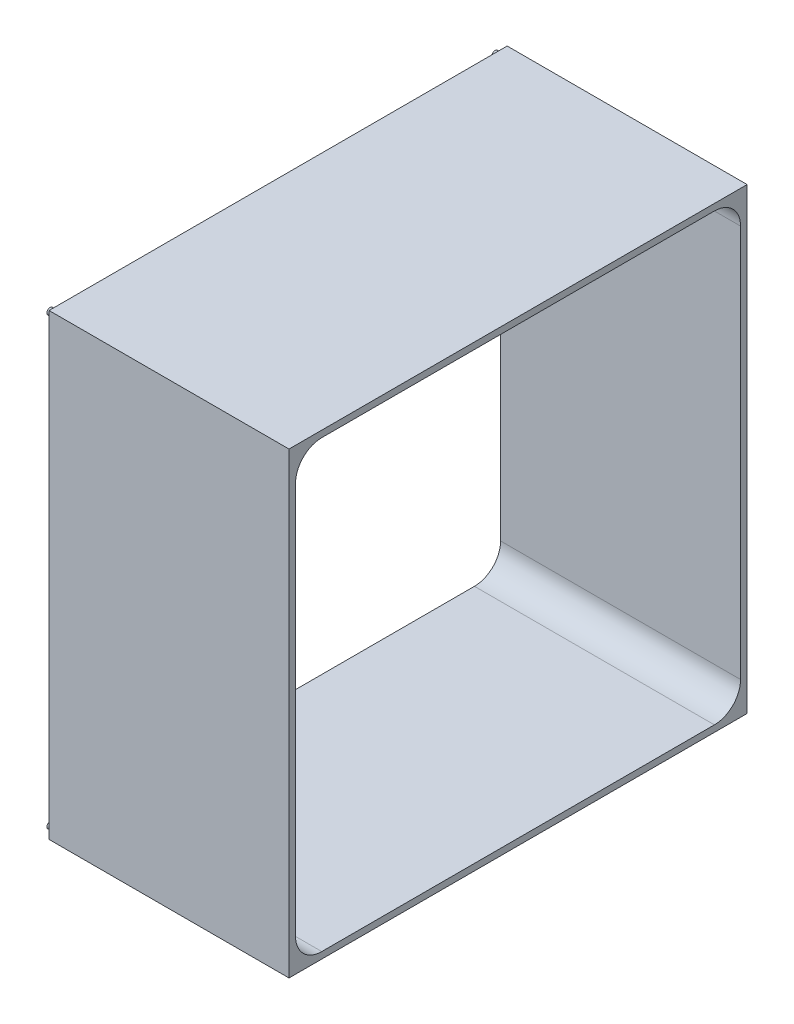
ISO-10303-21;
HEADER;
FILE_DESCRIPTION(('STEP AP214'),'2;1');
FILE_NAME('part.step','',(''),(''),'','','');
FILE_SCHEMA(('AUTOMOTIVE_DESIGN { 1 0 10303 214 1 1 1 1 }'));
ENDSEC;
DATA;
#1=APPLICATION_CONTEXT('core data for automotive mechanical design processes');
#2=APPLICATION_PROTOCOL_DEFINITION('international standard','automotive_design',2000,#1);
#3=PRODUCT_CONTEXT('',#1,'mechanical');
#4=PRODUCT('Part','Part','',(#3));
#5=PRODUCT_RELATED_PRODUCT_CATEGORY('part','',(#4));
#6=PRODUCT_DEFINITION_FORMATION('','',#4);
#7=PRODUCT_DEFINITION_CONTEXT('part definition',#1,'design');
#8=PRODUCT_DEFINITION('design','',#6,#7);
#9=PRODUCT_DEFINITION_SHAPE('','',#8);
#10=(LENGTH_UNIT() NAMED_UNIT(*) SI_UNIT(.MILLI.,.METRE.));
#11=(NAMED_UNIT(*) PLANE_ANGLE_UNIT() SI_UNIT($,.RADIAN.));
#12=(NAMED_UNIT(*) SI_UNIT($,.STERADIAN.) SOLID_ANGLE_UNIT());
#13=UNCERTAINTY_MEASURE_WITH_UNIT(LENGTH_MEASURE(1.E-05),#10,'distance_accuracy_value','');
#14=(GEOMETRIC_REPRESENTATION_CONTEXT(3) GLOBAL_UNCERTAINTY_ASSIGNED_CONTEXT((#13)) GLOBAL_UNIT_ASSIGNED_CONTEXT((#10,
#11,#12)) REPRESENTATION_CONTEXT('',''));
#15=CARTESIAN_POINT('',(0.,0.,0.));
#16=DIRECTION('',(0.,0.,1.));
#17=DIRECTION('',(1.,0.,0.));
#18=AXIS2_PLACEMENT_3D('',#15,#16,#17);
#19=CARTESIAN_POINT('',(110.,105.,-105.));
#20=DIRECTION('',(0.,0.,1.));
#21=DIRECTION('',(0.,-1.,0.));
#22=AXIS2_PLACEMENT_3D('',#19,#20,#21);
#23=PLANE('',#22);
#24=DIRECTION('',(0.,1.,0.));
#25=VECTOR('',#24,1.);
#26=CARTESIAN_POINT('',(0.,105.,-105.));
#27=LINE('',#26,#25);
#28=CARTESIAN_POINT('',(0.,-105.,-105.));
#29=VERTEX_POINT('',#28);
#30=CARTESIAN_POINT('',(0.,105.,-105.));
#31=VERTEX_POINT('',#30);
#32=EDGE_CURVE('E153',#29,#31,#27,.T.);
#33=ORIENTED_EDGE('',*,*,#32,.T.);
#34=DIRECTION('',(-1.,0.,0.));
#35=VECTOR('',#34,1.);
#36=CARTESIAN_POINT('',(110.,105.,-105.));
#37=LINE('',#36,#35);
#38=CARTESIAN_POINT('',(110.,105.,-105.));
#39=VERTEX_POINT('',#38);
#40=EDGE_CURVE('E133',#39,#31,#37,.T.);
#41=ORIENTED_EDGE('',*,*,#40,.F.);
#42=DIRECTION('',(0.,1.,0.));
#43=VECTOR('',#42,1.);
#44=CARTESIAN_POINT('',(110.,105.,-105.));
#45=LINE('',#44,#43);
#46=CARTESIAN_POINT('',(110.,-105.,-105.));
#47=VERTEX_POINT('',#46);
#48=EDGE_CURVE('E143',#47,#39,#45,.T.);
#49=ORIENTED_EDGE('',*,*,#48,.F.);
#50=DIRECTION('',(-1.,0.,0.));
#51=VECTOR('',#50,1.);
#52=CARTESIAN_POINT('',(110.,-105.,-105.));
#53=LINE('',#52,#51);
#54=EDGE_CURVE('E225',#47,#29,#53,.T.);
#55=ORIENTED_EDGE('',*,*,#54,.T.);
#56=EDGE_LOOP('',(#33,#41,#49,#55));
#57=FACE_BOUND('',#56,.T.);
#58=ADVANCED_FACE('F39',(#57),#23,.F.);
#59=CARTESIAN_POINT('',(110.,105.,105.));
#60=DIRECTION('',(0.,-1.,0.));
#61=DIRECTION('',(0.,0.,-1.));
#62=AXIS2_PLACEMENT_3D('',#59,#60,#61);
#63=PLANE('',#62);
#64=DIRECTION('',(0.,0.,1.));
#65=VECTOR('',#64,1.);
#66=CARTESIAN_POINT('',(0.,105.,105.));
#67=LINE('',#66,#65);
#68=CARTESIAN_POINT('',(0.,105.,105.));
#69=VERTEX_POINT('',#68);
#70=EDGE_CURVE('E221',#31,#69,#67,.T.);
#71=ORIENTED_EDGE('',*,*,#70,.T.);
#72=DIRECTION('',(-1.,0.,0.));
#73=VECTOR('',#72,1.);
#74=CARTESIAN_POINT('',(110.,105.,105.));
#75=LINE('',#74,#73);
#76=CARTESIAN_POINT('',(110.,105.,105.));
#77=VERTEX_POINT('',#76);
#78=EDGE_CURVE('E140',#77,#69,#75,.T.);
#79=ORIENTED_EDGE('',*,*,#78,.F.);
#80=DIRECTION('',(0.,0.,1.));
#81=VECTOR('',#80,1.);
#82=CARTESIAN_POINT('',(110.,105.,105.));
#83=LINE('',#82,#81);
#84=EDGE_CURVE('E128',#39,#77,#83,.T.);
#85=ORIENTED_EDGE('',*,*,#84,.F.);
#86=ORIENTED_EDGE('',*,*,#40,.T.);
#87=EDGE_LOOP('',(#71,#79,#85,#86));
#88=FACE_BOUND('',#87,.T.);
#89=ADVANCED_FACE('F135',(#88),#63,.F.);
#90=CARTESIAN_POINT('',(110.,105.,105.));
#91=DIRECTION('',(0.,0.,-1.));
#92=DIRECTION('',(0.,1.,0.));
#93=AXIS2_PLACEMENT_3D('',#90,#91,#92);
#94=PLANE('',#93);
#95=DIRECTION('',(0.,-1.,0.));
#96=VECTOR('',#95,1.);
#97=CARTESIAN_POINT('',(0.,105.,105.));
#98=LINE('',#97,#96);
#99=CARTESIAN_POINT('',(0.,-105.,105.));
#100=VERTEX_POINT('',#99);
#101=EDGE_CURVE('E226',#69,#100,#98,.T.);
#102=ORIENTED_EDGE('',*,*,#101,.T.);
#103=DIRECTION('',(-1.,0.,0.));
#104=VECTOR('',#103,1.);
#105=CARTESIAN_POINT('',(110.,-105.,105.));
#106=LINE('',#105,#104);
#107=CARTESIAN_POINT('',(110.,-105.,105.));
#108=VERTEX_POINT('',#107);
#109=EDGE_CURVE('E158',#108,#100,#106,.T.);
#110=ORIENTED_EDGE('',*,*,#109,.F.);
#111=DIRECTION('',(0.,-1.,0.));
#112=VECTOR('',#111,1.);
#113=CARTESIAN_POINT('',(110.,105.,105.));
#114=LINE('',#113,#112);
#115=EDGE_CURVE('E138',#77,#108,#114,.T.);
#116=ORIENTED_EDGE('',*,*,#115,.F.);
#117=ORIENTED_EDGE('',*,*,#78,.T.);
#118=EDGE_LOOP('',(#102,#110,#116,#117));
#119=FACE_BOUND('',#118,.T.);
#120=ADVANCED_FACE('F236',(#119),#94,.F.);
#121=CARTESIAN_POINT('',(110.,-105.,105.));
#122=DIRECTION('',(0.,1.,0.));
#123=DIRECTION('',(0.,0.,1.));
#124=AXIS2_PLACEMENT_3D('',#121,#122,#123);
#125=PLANE('',#124);
#126=DIRECTION('',(0.,0.,-1.));
#127=VECTOR('',#126,1.);
#128=CARTESIAN_POINT('',(0.,-105.,105.));
#129=LINE('',#128,#127);
#130=EDGE_CURVE('E147',#100,#29,#129,.T.);
#131=ORIENTED_EDGE('',*,*,#130,.T.);
#132=ORIENTED_EDGE('',*,*,#54,.F.);
#133=DIRECTION('',(0.,0.,-1.));
#134=VECTOR('',#133,1.);
#135=CARTESIAN_POINT('',(110.,-105.,105.));
#136=LINE('',#135,#134);
#137=EDGE_CURVE('E148',#108,#47,#136,.T.);
#138=ORIENTED_EDGE('',*,*,#137,.F.);
#139=ORIENTED_EDGE('',*,*,#109,.T.);
#140=EDGE_LOOP('',(#131,#132,#138,#139));
#141=FACE_BOUND('',#140,.T.);
#142=ADVANCED_FACE('F234',(#141),#125,.F.);
#143=CARTESIAN_POINT('',(110.,0.,0.));
#144=DIRECTION('',(1.,0.,0.));
#145=DIRECTION('',(0.,0.,-1.));
#146=AXIS2_PLACEMENT_3D('',#143,#144,#145);
#147=PLANE('',#146);
#148=DIRECTION('',(0.,0.,-1.));
#149=VECTOR('',#148,1.);
#150=CARTESIAN_POINT('',(110.,-102.,102.));
#151=LINE('',#150,#149);
#152=CARTESIAN_POINT('',(110.,-102.,90.));
#153=VERTEX_POINT('',#152);
#154=CARTESIAN_POINT('',(110.,-102.,-90.));
#155=VERTEX_POINT('',#154);
#156=EDGE_CURVE('E209',#153,#155,#151,.T.);
#157=ORIENTED_EDGE('',*,*,#156,.F.);
#158=CARTESIAN_POINT('',(110.,-90.,90.));
#159=DIRECTION('',(1.,0.,0.));
#160=DIRECTION('',(0.,0.,-1.));
#161=AXIS2_PLACEMENT_3D('',#158,#159,#160);
#162=CIRCLE('',#161,12.);
#163=CARTESIAN_POINT('',(110.,-90.,102.));
#164=VERTEX_POINT('',#163);
#165=EDGE_CURVE('E186',#153,#164,#162,.F.);
#166=ORIENTED_EDGE('',*,*,#165,.T.);
#167=DIRECTION('',(0.,-1.,0.));
#168=VECTOR('',#167,1.);
#169=CARTESIAN_POINT('',(110.,102.,102.));
#170=LINE('',#169,#168);
#171=CARTESIAN_POINT('',(110.,90.,102.));
#172=VERTEX_POINT('',#171);
#173=EDGE_CURVE('E201',#172,#164,#170,.T.);
#174=ORIENTED_EDGE('',*,*,#173,.F.);
#175=CARTESIAN_POINT('',(110.,90.,90.0000000000001));
#176=DIRECTION('',(1.,0.,0.));
#177=DIRECTION('',(0.,0.,-1.));
#178=AXIS2_PLACEMENT_3D('',#175,#176,#177);
#179=CIRCLE('',#178,12.);
#180=CARTESIAN_POINT('',(110.,102.,90.0000000000001));
#181=VERTEX_POINT('',#180);
#182=EDGE_CURVE('E189',#172,#181,#179,.F.);
#183=ORIENTED_EDGE('',*,*,#182,.T.);
#184=DIRECTION('',(0.,0.,1.));
#185=VECTOR('',#184,1.);
#186=CARTESIAN_POINT('',(110.,102.,-102.));
#187=LINE('',#186,#185);
#188=CARTESIAN_POINT('',(110.,102.,-89.9999999999999));
#189=VERTEX_POINT('',#188);
#190=EDGE_CURVE('E216',#189,#181,#187,.T.);
#191=ORIENTED_EDGE('',*,*,#190,.F.);
#192=CARTESIAN_POINT('',(110.,90.,-89.9999999999999));
#193=DIRECTION('',(1.,0.,0.));
#194=DIRECTION('',(0.,0.,-1.));
#195=AXIS2_PLACEMENT_3D('',#192,#193,#194);
#196=CIRCLE('',#195,12.);
#197=CARTESIAN_POINT('',(110.,90.,-102.));
#198=VERTEX_POINT('',#197);
#199=EDGE_CURVE('E185',#189,#198,#196,.F.);
#200=ORIENTED_EDGE('',*,*,#199,.T.);
#201=DIRECTION('',(0.,1.,0.));
#202=VECTOR('',#201,1.);
#203=CARTESIAN_POINT('',(110.,-102.,-102.));
#204=LINE('',#203,#202);
#205=CARTESIAN_POINT('',(110.,-90.,-102.));
#206=VERTEX_POINT('',#205);
#207=EDGE_CURVE('E213',#206,#198,#204,.T.);
#208=ORIENTED_EDGE('',*,*,#207,.F.);
#209=CARTESIAN_POINT('',(110.,-90.,-90.));
#210=DIRECTION('',(1.,0.,0.));
#211=DIRECTION('',(0.,0.,-1.));
#212=AXIS2_PLACEMENT_3D('',#209,#210,#211);
#213=CIRCLE('',#212,12.);
#214=EDGE_CURVE('E179',#206,#155,#213,.F.);
#215=ORIENTED_EDGE('',*,*,#214,.T.);
#216=EDGE_LOOP('',(#157,#166,#174,#183,#191,#200,#208,#215));
#217=FACE_BOUND('',#216,.T.);
#218=ORIENTED_EDGE('',*,*,#48,.T.);
#219=ORIENTED_EDGE('',*,*,#84,.T.);
#220=ORIENTED_EDGE('',*,*,#115,.T.);
#221=ORIENTED_EDGE('',*,*,#137,.T.);
#222=EDGE_LOOP('',(#218,#219,#220,#221));
#223=FACE_BOUND('',#222,.T.);
#224=ADVANCED_FACE('F145',(#217,#223),#147,.T.);
#225=CARTESIAN_POINT('',(0.,0.,0.));
#226=DIRECTION('',(1.,0.,0.));
#227=DIRECTION('',(0.,0.,-1.));
#228=AXIS2_PLACEMENT_3D('',#225,#226,#227);
#229=PLANE('',#228);
#230=CARTESIAN_POINT('',(0.,-102.,102.));
#231=DIRECTION('',(1.,0.,0.));
#232=DIRECTION('',(0.,0.,-1.));
#233=AXIS2_PLACEMENT_3D('',#230,#231,#232);
#234=CIRCLE('',#233,1.5);
#235=CARTESIAN_POINT('',(0.,-102.,100.5));
#236=VERTEX_POINT('',#235);
#237=EDGE_CURVE('E11',#236,#236,#234,.F.);
#238=ORIENTED_EDGE('',*,*,#237,.F.);
#239=EDGE_LOOP('',(#238));
#240=FACE_BOUND('',#239,.T.);
#241=CARTESIAN_POINT('',(0.,-102.,-102.));
#242=DIRECTION('',(1.,0.,0.));
#243=DIRECTION('',(0.,0.,1.));
#244=AXIS2_PLACEMENT_3D('',#241,#242,#243);
#245=CIRCLE('',#244,1.5);
#246=CARTESIAN_POINT('',(0.,-102.,-100.5));
#247=VERTEX_POINT('',#246);
#248=EDGE_CURVE('E344',#247,#247,#245,.T.);
#249=ORIENTED_EDGE('',*,*,#248,.T.);
#250=EDGE_LOOP('',(#249));
#251=FACE_BOUND('',#250,.T.);
#252=CARTESIAN_POINT('',(0.,102.,102.));
#253=DIRECTION('',(1.,0.,0.));
#254=DIRECTION('',(0.,0.,-1.));
#255=AXIS2_PLACEMENT_3D('',#252,#253,#254);
#256=CIRCLE('',#255,1.5);
#257=CARTESIAN_POINT('',(0.,102.,100.5));
#258=VERTEX_POINT('',#257);
#259=EDGE_CURVE('E348',#258,#258,#256,.T.);
#260=ORIENTED_EDGE('',*,*,#259,.T.);
#261=EDGE_LOOP('',(#260));
#262=FACE_BOUND('',#261,.T.);
#263=CARTESIAN_POINT('',(0.,102.,-102.));
#264=DIRECTION('',(-1.,0.,0.));
#265=DIRECTION('',(0.,0.,1.));
#266=AXIS2_PLACEMENT_3D('',#263,#264,#265);
#267=CIRCLE('',#266,1.5);
#268=CARTESIAN_POINT('',(0.,102.,-100.5));
#269=VERTEX_POINT('',#268);
#270=EDGE_CURVE('E50',#269,#269,#267,.T.);
#271=ORIENTED_EDGE('',*,*,#270,.F.);
#272=EDGE_LOOP('',(#271));
#273=FACE_BOUND('',#272,.T.);
#274=DIRECTION('',(0.,0.,1.));
#275=VECTOR('',#274,1.);
#276=CARTESIAN_POINT('',(0.,102.,-102.));
#277=LINE('',#276,#275);
#278=CARTESIAN_POINT('',(0.,102.,-89.9999999999999));
#279=VERTEX_POINT('',#278);
#280=CARTESIAN_POINT('',(0.,102.,90.0000000000001));
#281=VERTEX_POINT('',#280);
#282=EDGE_CURVE('E206',#279,#281,#277,.T.);
#283=ORIENTED_EDGE('',*,*,#282,.T.);
#284=CARTESIAN_POINT('',(0.,90.,90.0000000000001));
#285=DIRECTION('',(1.,0.,0.));
#286=DIRECTION('',(0.,0.,-1.));
#287=AXIS2_PLACEMENT_3D('',#284,#285,#286);
#288=CIRCLE('',#287,12.);
#289=CARTESIAN_POINT('',(0.,90.,102.));
#290=VERTEX_POINT('',#289);
#291=EDGE_CURVE('E61',#281,#290,#288,.T.);
#292=ORIENTED_EDGE('',*,*,#291,.T.);
#293=DIRECTION('',(0.,-1.,0.));
#294=VECTOR('',#293,1.);
#295=CARTESIAN_POINT('',(0.,102.,102.));
#296=LINE('',#295,#294);
#297=CARTESIAN_POINT('',(0.,-90.,102.));
#298=VERTEX_POINT('',#297);
#299=EDGE_CURVE('E208',#290,#298,#296,.T.);
#300=ORIENTED_EDGE('',*,*,#299,.T.);
#301=CARTESIAN_POINT('',(0.,-90.,90.));
#302=DIRECTION('',(1.,0.,0.));
#303=DIRECTION('',(0.,0.,-1.));
#304=AXIS2_PLACEMENT_3D('',#301,#302,#303);
#305=CIRCLE('',#304,12.);
#306=CARTESIAN_POINT('',(0.,-102.,90.));
#307=VERTEX_POINT('',#306);
#308=EDGE_CURVE('E187',#298,#307,#305,.T.);
#309=ORIENTED_EDGE('',*,*,#308,.T.);
#310=DIRECTION('',(0.,0.,-1.));
#311=VECTOR('',#310,1.);
#312=CARTESIAN_POINT('',(0.,-102.,102.));
#313=LINE('',#312,#311);
#314=CARTESIAN_POINT('',(0.,-102.,-90.));
#315=VERTEX_POINT('',#314);
#316=EDGE_CURVE('E200',#307,#315,#313,.T.);
#317=ORIENTED_EDGE('',*,*,#316,.T.);
#318=CARTESIAN_POINT('',(0.,-90.,-90.));
#319=DIRECTION('',(1.,0.,0.));
#320=DIRECTION('',(0.,0.,-1.));
#321=AXIS2_PLACEMENT_3D('',#318,#319,#320);
#322=CIRCLE('',#321,12.);
#323=CARTESIAN_POINT('',(0.,-90.,-102.));
#324=VERTEX_POINT('',#323);
#325=EDGE_CURVE('E178',#315,#324,#322,.T.);
#326=ORIENTED_EDGE('',*,*,#325,.T.);
#327=DIRECTION('',(0.,1.,0.));
#328=VECTOR('',#327,1.);
#329=CARTESIAN_POINT('',(0.,-102.,-102.));
#330=LINE('',#329,#328);
#331=CARTESIAN_POINT('',(0.,90.,-102.));
#332=VERTEX_POINT('',#331);
#333=EDGE_CURVE('E205',#324,#332,#330,.T.);
#334=ORIENTED_EDGE('',*,*,#333,.T.);
#335=CARTESIAN_POINT('',(0.,90.,-89.9999999999999));
#336=DIRECTION('',(1.,0.,0.));
#337=DIRECTION('',(0.,0.,-1.));
#338=AXIS2_PLACEMENT_3D('',#335,#336,#337);
#339=CIRCLE('',#338,12.);
#340=EDGE_CURVE('E184',#332,#279,#339,.T.);
#341=ORIENTED_EDGE('',*,*,#340,.T.);
#342=EDGE_LOOP('',(#283,#292,#300,#309,#317,#326,#334,#341));
#343=FACE_BOUND('',#342,.T.);
#344=ORIENTED_EDGE('',*,*,#32,.F.);
#345=ORIENTED_EDGE('',*,*,#130,.F.);
#346=ORIENTED_EDGE('',*,*,#101,.F.);
#347=ORIENTED_EDGE('',*,*,#70,.F.);
#348=EDGE_LOOP('',(#344,#345,#346,#347));
#349=FACE_BOUND('',#348,.T.);
#350=ADVANCED_FACE('F240',(#240,#251,#262,#273,#343,#349),#229,.F.);
#351=CARTESIAN_POINT('',(0.,-102.,102.));
#352=DIRECTION('',(0.,-1.,0.));
#353=DIRECTION('',(0.,0.,-1.));
#354=AXIS2_PLACEMENT_3D('',#351,#352,#353);
#355=PLANE('',#354);
#356=ORIENTED_EDGE('',*,*,#156,.T.);
#357=DIRECTION('',(1.,0.,0.));
#358=VECTOR('',#357,1.);
#359=CARTESIAN_POINT('',(0.,-102.,-90.));
#360=LINE('',#359,#358);
#361=EDGE_CURVE('E170',#155,#315,#360,.F.);
#362=ORIENTED_EDGE('',*,*,#361,.T.);
#363=ORIENTED_EDGE('',*,*,#316,.F.);
#364=DIRECTION('',(1.,0.,0.));
#365=VECTOR('',#364,1.);
#366=CARTESIAN_POINT('',(110.,-102.,90.));
#367=LINE('',#366,#365);
#368=EDGE_CURVE('E163',#307,#153,#367,.T.);
#369=ORIENTED_EDGE('',*,*,#368,.T.);
#370=EDGE_LOOP('',(#356,#362,#363,#369));
#371=FACE_BOUND('',#370,.T.);
#372=ADVANCED_FACE('F272',(#371),#355,.F.);
#373=CARTESIAN_POINT('',(0.,102.,102.));
#374=DIRECTION('',(0.,0.,1.));
#375=DIRECTION('',(0.,-1.,0.));
#376=AXIS2_PLACEMENT_3D('',#373,#374,#375);
#377=PLANE('',#376);
#378=ORIENTED_EDGE('',*,*,#173,.T.);
#379=DIRECTION('',(1.,0.,0.));
#380=VECTOR('',#379,1.);
#381=CARTESIAN_POINT('',(0.,-90.,102.));
#382=LINE('',#381,#380);
#383=EDGE_CURVE('E53',#164,#298,#382,.F.);
#384=ORIENTED_EDGE('',*,*,#383,.T.);
#385=ORIENTED_EDGE('',*,*,#299,.F.);
#386=DIRECTION('',(1.,0.,0.));
#387=VECTOR('',#386,1.);
#388=CARTESIAN_POINT('',(110.,90.,102.));
#389=LINE('',#388,#387);
#390=EDGE_CURVE('E173',#290,#172,#389,.T.);
#391=ORIENTED_EDGE('',*,*,#390,.T.);
#392=EDGE_LOOP('',(#378,#384,#385,#391));
#393=FACE_BOUND('',#392,.T.);
#394=ADVANCED_FACE('F288',(#393),#377,.F.);
#395=CARTESIAN_POINT('',(0.,102.,-102.));
#396=DIRECTION('',(0.,1.,0.));
#397=DIRECTION('',(0.,0.,1.));
#398=AXIS2_PLACEMENT_3D('',#395,#396,#397);
#399=PLANE('',#398);
#400=ORIENTED_EDGE('',*,*,#282,.F.);
#401=DIRECTION('',(1.,0.,0.));
#402=VECTOR('',#401,1.);
#403=CARTESIAN_POINT('',(110.,102.,-89.9999999999999));
#404=LINE('',#403,#402);
#405=EDGE_CURVE('E171',#279,#189,#404,.T.);
#406=ORIENTED_EDGE('',*,*,#405,.T.);
#407=ORIENTED_EDGE('',*,*,#190,.T.);
#408=DIRECTION('',(1.,0.,0.));
#409=VECTOR('',#408,1.);
#410=CARTESIAN_POINT('',(0.,102.,90.0000000000001));
#411=LINE('',#410,#409);
#412=EDGE_CURVE('E166',#181,#281,#411,.F.);
#413=ORIENTED_EDGE('',*,*,#412,.T.);
#414=EDGE_LOOP('',(#400,#406,#407,#413));
#415=FACE_BOUND('',#414,.T.);
#416=ADVANCED_FACE('F284',(#415),#399,.F.);
#417=CARTESIAN_POINT('',(0.,-102.,-102.));
#418=DIRECTION('',(0.,0.,-1.));
#419=DIRECTION('',(0.,1.,0.));
#420=AXIS2_PLACEMENT_3D('',#417,#418,#419);
#421=PLANE('',#420);
#422=ORIENTED_EDGE('',*,*,#333,.F.);
#423=DIRECTION('',(1.,0.,0.));
#424=VECTOR('',#423,1.);
#425=CARTESIAN_POINT('',(110.,-90.,-102.));
#426=LINE('',#425,#424);
#427=EDGE_CURVE('E156',#324,#206,#426,.T.);
#428=ORIENTED_EDGE('',*,*,#427,.T.);
#429=ORIENTED_EDGE('',*,*,#207,.T.);
#430=DIRECTION('',(1.,0.,0.));
#431=VECTOR('',#430,1.);
#432=CARTESIAN_POINT('',(0.,90.,-102.));
#433=LINE('',#432,#431);
#434=EDGE_CURVE('E152',#198,#332,#433,.F.);
#435=ORIENTED_EDGE('',*,*,#434,.T.);
#436=EDGE_LOOP('',(#422,#428,#429,#435));
#437=FACE_BOUND('',#436,.T.);
#438=ADVANCED_FACE('F258',(#437),#421,.F.);
#439=CARTESIAN_POINT('',(0.,-90.,-90.));
#440=DIRECTION('',(-1.,0.,0.));
#441=DIRECTION('',(0.,0.,1.));
#442=AXIS2_PLACEMENT_3D('',#439,#440,#441);
#443=CYLINDRICAL_SURFACE('',#442,12.);
#444=ORIENTED_EDGE('',*,*,#325,.F.);
#445=ORIENTED_EDGE('',*,*,#361,.F.);
#446=ORIENTED_EDGE('',*,*,#214,.F.);
#447=ORIENTED_EDGE('',*,*,#427,.F.);
#448=EDGE_LOOP('',(#444,#445,#446,#447));
#449=FACE_BOUND('',#448,.T.);
#450=ADVANCED_FACE('F252',(#449),#443,.F.);
#451=CARTESIAN_POINT('',(0.,90.,-89.9999999999999));
#452=DIRECTION('',(-1.,0.,0.));
#453=DIRECTION('',(0.,0.,1.));
#454=AXIS2_PLACEMENT_3D('',#451,#452,#453);
#455=CYLINDRICAL_SURFACE('',#454,12.);
#456=ORIENTED_EDGE('',*,*,#340,.F.);
#457=ORIENTED_EDGE('',*,*,#434,.F.);
#458=ORIENTED_EDGE('',*,*,#199,.F.);
#459=ORIENTED_EDGE('',*,*,#405,.F.);
#460=EDGE_LOOP('',(#456,#457,#458,#459));
#461=FACE_BOUND('',#460,.T.);
#462=ADVANCED_FACE('F254',(#461),#455,.F.);
#463=CARTESIAN_POINT('',(0.,-90.,90.));
#464=DIRECTION('',(-1.,0.,0.));
#465=DIRECTION('',(0.,0.,1.));
#466=AXIS2_PLACEMENT_3D('',#463,#464,#465);
#467=CYLINDRICAL_SURFACE('',#466,12.);
#468=ORIENTED_EDGE('',*,*,#308,.F.);
#469=ORIENTED_EDGE('',*,*,#383,.F.);
#470=ORIENTED_EDGE('',*,*,#165,.F.);
#471=ORIENTED_EDGE('',*,*,#368,.F.);
#472=EDGE_LOOP('',(#468,#469,#470,#471));
#473=FACE_BOUND('',#472,.T.);
#474=ADVANCED_FACE('F259',(#473),#467,.F.);
#475=CARTESIAN_POINT('',(0.,90.,90.0000000000001));
#476=DIRECTION('',(-1.,0.,0.));
#477=DIRECTION('',(0.,0.,1.));
#478=AXIS2_PLACEMENT_3D('',#475,#476,#477);
#479=CYLINDRICAL_SURFACE('',#478,12.);
#480=ORIENTED_EDGE('',*,*,#291,.F.);
#481=ORIENTED_EDGE('',*,*,#412,.F.);
#482=ORIENTED_EDGE('',*,*,#182,.F.);
#483=ORIENTED_EDGE('',*,*,#390,.F.);
#484=EDGE_LOOP('',(#480,#481,#482,#483));
#485=FACE_BOUND('',#484,.T.);
#486=ADVANCED_FACE('F41',(#485),#479,.F.);
#487=CARTESIAN_POINT('',(-2.5,102.,-102.));
#488=DIRECTION('',(1.,0.,0.));
#489=DIRECTION('',(0.,0.,-1.));
#490=AXIS2_PLACEMENT_3D('',#487,#488,#489);
#491=CYLINDRICAL_SURFACE('',#490,1.5);
#492=CARTESIAN_POINT('',(-2.5,102.,-102.));
#493=DIRECTION('',(-1.,0.,0.));
#494=DIRECTION('',(0.,0.,1.));
#495=AXIS2_PLACEMENT_3D('',#492,#493,#494);
#496=CIRCLE('',#495,1.5);
#497=CARTESIAN_POINT('',(-2.5,102.,-100.5));
#498=VERTEX_POINT('',#497);
#499=EDGE_CURVE('E197',#498,#498,#496,.T.);
#500=ORIENTED_EDGE('',*,*,#499,.F.);
#501=EDGE_LOOP('',(#500));
#502=FACE_BOUND('',#501,.T.);
#503=ORIENTED_EDGE('',*,*,#270,.T.);
#504=EDGE_LOOP('',(#503));
#505=FACE_BOUND('',#504,.T.);
#506=ADVANCED_FACE('F266',(#502,#505),#491,.T.);
#507=CARTESIAN_POINT('',(-2.5,102.,-102.));
#508=DIRECTION('',(-1.,0.,0.));
#509=DIRECTION('',(0.,0.,1.));
#510=AXIS2_PLACEMENT_3D('',#507,#508,#509);
#511=PLANE('',#510);
#512=ORIENTED_EDGE('',*,*,#499,.T.);
#513=EDGE_LOOP('',(#512));
#514=FACE_BOUND('',#513,.T.);
#515=ADVANCED_FACE('F309',(#514),#511,.T.);
#516=CARTESIAN_POINT('',(-2.5,102.,102.));
#517=DIRECTION('',(1.,0.,0.));
#518=DIRECTION('',(0.,0.,-1.));
#519=AXIS2_PLACEMENT_3D('',#516,#517,#518);
#520=CYLINDRICAL_SURFACE('',#519,1.5);
#521=CARTESIAN_POINT('',(-2.5,102.,102.));
#522=DIRECTION('',(1.,0.,0.));
#523=DIRECTION('',(0.,0.,-1.));
#524=AXIS2_PLACEMENT_3D('',#521,#522,#523);
#525=CIRCLE('',#524,1.5);
#526=CARTESIAN_POINT('',(-2.5,102.,100.5));
#527=VERTEX_POINT('',#526);
#528=EDGE_CURVE('E355',#527,#527,#525,.T.);
#529=ORIENTED_EDGE('',*,*,#528,.T.);
#530=EDGE_LOOP('',(#529));
#531=FACE_BOUND('',#530,.T.);
#532=ORIENTED_EDGE('',*,*,#259,.F.);
#533=EDGE_LOOP('',(#532));
#534=FACE_BOUND('',#533,.T.);
#535=ADVANCED_FACE('F314',(#531,#534),#520,.T.);
#536=CARTESIAN_POINT('',(-2.5,102.,102.));
#537=DIRECTION('',(-1.,0.,0.));
#538=DIRECTION('',(0.,0.,-1.));
#539=AXIS2_PLACEMENT_3D('',#536,#537,#538);
#540=PLANE('',#539);
#541=ORIENTED_EDGE('',*,*,#528,.F.);
#542=EDGE_LOOP('',(#541));
#543=FACE_BOUND('',#542,.T.);
#544=ADVANCED_FACE('F318',(#543),#540,.T.);
#545=CARTESIAN_POINT('',(-2.5,-102.,-102.));
#546=DIRECTION('',(1.,0.,0.));
#547=DIRECTION('',(0.,0.,-1.));
#548=AXIS2_PLACEMENT_3D('',#545,#546,#547);
#549=CYLINDRICAL_SURFACE('',#548,1.5);
#550=CARTESIAN_POINT('',(-2.5,-102.,-102.));
#551=DIRECTION('',(1.,0.,0.));
#552=DIRECTION('',(0.,0.,1.));
#553=AXIS2_PLACEMENT_3D('',#550,#551,#552);
#554=CIRCLE('',#553,1.5);
#555=CARTESIAN_POINT('',(-2.5,-102.,-100.5));
#556=VERTEX_POINT('',#555);
#557=EDGE_CURVE('E347',#556,#556,#554,.T.);
#558=ORIENTED_EDGE('',*,*,#557,.T.);
#559=EDGE_LOOP('',(#558));
#560=FACE_BOUND('',#559,.T.);
#561=ORIENTED_EDGE('',*,*,#248,.F.);
#562=EDGE_LOOP('',(#561));
#563=FACE_BOUND('',#562,.T.);
#564=ADVANCED_FACE('F325',(#560,#563),#549,.T.);
#565=CARTESIAN_POINT('',(-2.5,-102.,-102.));
#566=DIRECTION('',(-1.,0.,0.));
#567=DIRECTION('',(0.,0.,1.));
#568=AXIS2_PLACEMENT_3D('',#565,#566,#567);
#569=PLANE('',#568);
#570=ORIENTED_EDGE('',*,*,#557,.F.);
#571=EDGE_LOOP('',(#570));
#572=FACE_BOUND('',#571,.T.);
#573=ADVANCED_FACE('F326',(#572),#569,.T.);
#574=CARTESIAN_POINT('',(-2.5,-102.,102.));
#575=DIRECTION('',(1.,0.,0.));
#576=DIRECTION('',(0.,0.,-1.));
#577=AXIS2_PLACEMENT_3D('',#574,#575,#576);
#578=CYLINDRICAL_SURFACE('',#577,1.5);
#579=CARTESIAN_POINT('',(-2.5,-102.,102.));
#580=DIRECTION('',(-1.,0.,0.));
#581=DIRECTION('',(0.,0.,-1.));
#582=AXIS2_PLACEMENT_3D('',#579,#580,#581);
#583=CIRCLE('',#582,1.5);
#584=CARTESIAN_POINT('',(-2.5,-102.,100.5));
#585=VERTEX_POINT('',#584);
#586=EDGE_CURVE('E345',#585,#585,#583,.T.);
#587=ORIENTED_EDGE('',*,*,#586,.F.);
#588=EDGE_LOOP('',(#587));
#589=FACE_BOUND('',#588,.T.);
#590=ORIENTED_EDGE('',*,*,#237,.T.);
#591=EDGE_LOOP('',(#590));
#592=FACE_BOUND('',#591,.T.);
#593=ADVANCED_FACE('F329',(#589,#592),#578,.T.);
#594=CARTESIAN_POINT('',(-2.5,-102.,102.));
#595=DIRECTION('',(-1.,0.,0.));
#596=DIRECTION('',(0.,0.,-1.));
#597=AXIS2_PLACEMENT_3D('',#594,#595,#596);
#598=PLANE('',#597);
#599=ORIENTED_EDGE('',*,*,#586,.T.);
#600=EDGE_LOOP('',(#599));
#601=FACE_BOUND('',#600,.T.);
#602=ADVANCED_FACE('F331',(#601),#598,.T.);
#603=CLOSED_SHELL('',(#58,#89,#120,#142,#224,#350,#372,#394,#416,#438,#450,#462,#474,#486,#506,
#515,#535,#544,#564,#573,#593,#602));
#604=MANIFOLD_SOLID_BREP('B2',#603);
#605=ADVANCED_BREP_SHAPE_REPRESENTATION('',(#18,#604),#14);
#606=SHAPE_DEFINITION_REPRESENTATION(#9,#605);
ENDSEC;
END-ISO-10303-21;
